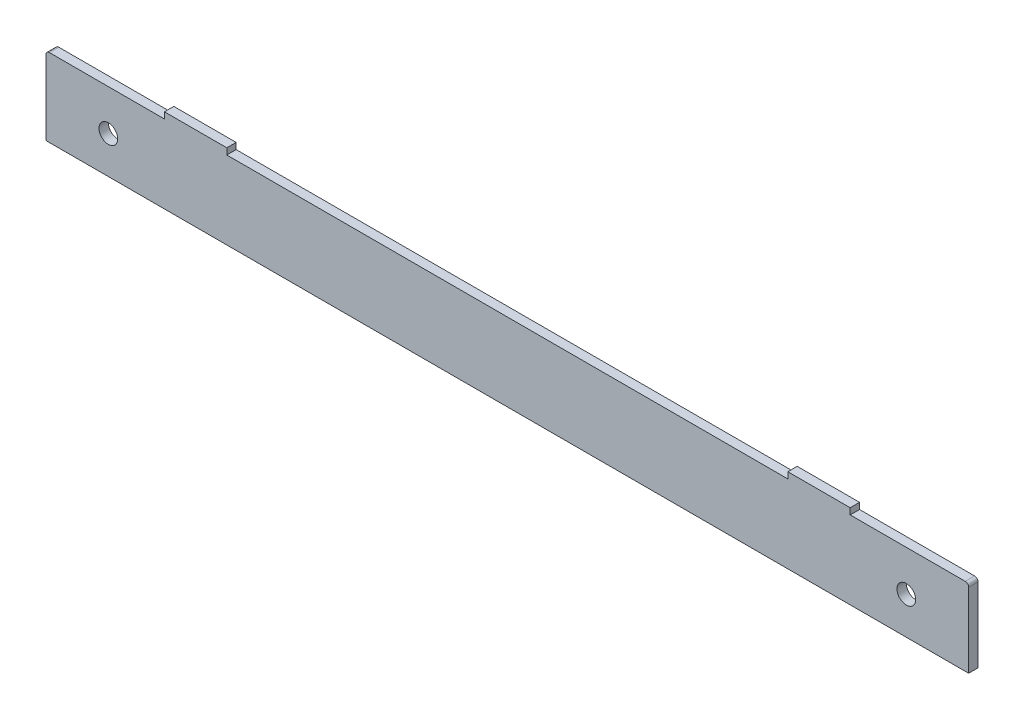
ISO-10303-21;
HEADER;
FILE_DESCRIPTION(('STEP AP214'),'2;1');
FILE_NAME('part.step','',(''),(''),'','','');
FILE_SCHEMA(('AUTOMOTIVE_DESIGN { 1 0 10303 214 1 1 1 1 }'));
ENDSEC;
DATA;
#1=APPLICATION_CONTEXT('core data for automotive mechanical design processes');
#2=APPLICATION_PROTOCOL_DEFINITION('international standard','automotive_design',2000,#1);
#3=PRODUCT_CONTEXT('',#1,'mechanical');
#4=PRODUCT('Part','Part','',(#3));
#5=PRODUCT_RELATED_PRODUCT_CATEGORY('part','',(#4));
#6=PRODUCT_DEFINITION_FORMATION('','',#4);
#7=PRODUCT_DEFINITION_CONTEXT('part definition',#1,'design');
#8=PRODUCT_DEFINITION('design','',#6,#7);
#9=PRODUCT_DEFINITION_SHAPE('','',#8);
#10=(LENGTH_UNIT() NAMED_UNIT(*) SI_UNIT(.MILLI.,.METRE.));
#11=(NAMED_UNIT(*) PLANE_ANGLE_UNIT() SI_UNIT($,.RADIAN.));
#12=(NAMED_UNIT(*) SI_UNIT($,.STERADIAN.) SOLID_ANGLE_UNIT());
#13=UNCERTAINTY_MEASURE_WITH_UNIT(LENGTH_MEASURE(1.E-05),#10,'distance_accuracy_value','');
#14=(GEOMETRIC_REPRESENTATION_CONTEXT(3) GLOBAL_UNCERTAINTY_ASSIGNED_CONTEXT((#13)) GLOBAL_UNIT_ASSIGNED_CONTEXT((#10,
#11,#12)) REPRESENTATION_CONTEXT('',''));
#15=CARTESIAN_POINT('',(0.,0.,0.));
#16=DIRECTION('',(0.,0.,1.));
#17=DIRECTION('',(1.,0.,0.));
#18=AXIS2_PLACEMENT_3D('',#15,#16,#17);
#19=CARTESIAN_POINT('',(-52.7153432272541,26.1805647840531,-3.));
#20=DIRECTION('',(0.,1.,0.));
#21=DIRECTION('',(0.,0.,1.));
#22=AXIS2_PLACEMENT_3D('',#19,#20,#21);
#23=PLANE('',#22);
#24=DIRECTION('',(-1.,0.,0.));
#25=VECTOR('',#24,1.);
#26=CARTESIAN_POINT('',(-52.7153432272541,26.1805647840531,0.));
#27=LINE('',#26,#25);
#28=CARTESIAN_POINT('',(184.184656772746,26.1805647840531,0.));
#29=VERTEX_POINT('',#28);
#30=CARTESIAN_POINT('',(4.18465677274588,26.1805647840531,0.));
#31=VERTEX_POINT('',#30);
#32=EDGE_CURVE('E218',#29,#31,#27,.T.);
#33=ORIENTED_EDGE('',*,*,#32,.F.);
#34=DIRECTION('',(0.,0.,1.));
#35=VECTOR('',#34,1.);
#36=CARTESIAN_POINT('',(184.184656772746,26.1805647840531,-3.00000000000005));
#37=LINE('',#36,#35);
#38=CARTESIAN_POINT('',(184.184656772746,26.1805647840531,-3.00000000000005));
#39=VERTEX_POINT('',#38);
#40=EDGE_CURVE('E52',#39,#29,#37,.T.);
#41=ORIENTED_EDGE('',*,*,#40,.F.);
#42=DIRECTION('',(-1.,0.,0.));
#43=VECTOR('',#42,1.);
#44=CARTESIAN_POINT('',(-52.7153432272541,26.1805647840531,-3.));
#45=LINE('',#44,#43);
#46=CARTESIAN_POINT('',(4.18465677274588,26.1805647840531,-3.));
#47=VERTEX_POINT('',#46);
#48=EDGE_CURVE('E200',#39,#47,#45,.T.);
#49=ORIENTED_EDGE('',*,*,#48,.T.);
#50=DIRECTION('',(0.,0.,-1.));
#51=VECTOR('',#50,1.);
#52=CARTESIAN_POINT('',(4.18465677274588,26.1805647840531,-3.));
#53=LINE('',#52,#51);
#54=EDGE_CURVE('E160',#31,#47,#53,.T.);
#55=ORIENTED_EDGE('',*,*,#54,.F.);
#56=EDGE_LOOP('',(#33,#41,#49,#55));
#57=FACE_BOUND('',#56,.T.);
#58=ADVANCED_FACE('F35',(#57),#23,.T.);
#59=CARTESIAN_POINT('',(241.084656772746,26.1805647840531,-3.));
#60=VERTEX_POINT('',#59);
#61=CARTESIAN_POINT('',(204.184656772746,26.1805647840531,-3.00000000000004));
#62=VERTEX_POINT('',#61);
#63=EDGE_CURVE('E196',#60,#62,#45,.T.);
#64=ORIENTED_EDGE('',*,*,#63,.T.);
#65=DIRECTION('',(0.,0.,-1.));
#66=VECTOR('',#65,1.);
#67=CARTESIAN_POINT('',(204.184656772746,26.1805647840531,-3.00000000000004));
#68=LINE('',#67,#66);
#69=CARTESIAN_POINT('',(204.184656772746,26.1805647840531,0.));
#70=VERTEX_POINT('',#69);
#71=EDGE_CURVE('E156',#70,#62,#68,.T.);
#72=ORIENTED_EDGE('',*,*,#71,.F.);
#73=CARTESIAN_POINT('',(241.084656772746,26.1805647840531,0.));
#74=VERTEX_POINT('',#73);
#75=EDGE_CURVE('E215',#74,#70,#27,.T.);
#76=ORIENTED_EDGE('',*,*,#75,.F.);
#77=DIRECTION('',(0.,0.,1.));
#78=VECTOR('',#77,1.);
#79=CARTESIAN_POINT('',(241.084656772746,26.1805647840531,-3.));
#80=LINE('',#79,#78);
#81=EDGE_CURVE('E232',#60,#74,#80,.T.);
#82=ORIENTED_EDGE('',*,*,#81,.F.);
#83=EDGE_LOOP('',(#64,#72,#76,#82));
#84=FACE_BOUND('',#83,.T.);
#85=ADVANCED_FACE('F262',(#84),#23,.T.);
#86=CARTESIAN_POINT('',(-15.8153432272541,26.1805647840531,0.));
#87=VERTEX_POINT('',#86);
#88=CARTESIAN_POINT('',(-52.7153432272541,26.1805647840531,0.));
#89=VERTEX_POINT('',#88);
#90=EDGE_CURVE('E214',#87,#89,#27,.T.);
#91=ORIENTED_EDGE('',*,*,#90,.F.);
#92=DIRECTION('',(0.,0.,1.));
#93=VECTOR('',#92,1.);
#94=CARTESIAN_POINT('',(-15.8153432272541,26.1805647840531,-3.));
#95=LINE('',#94,#93);
#96=CARTESIAN_POINT('',(-15.8153432272541,26.1805647840531,-3.));
#97=VERTEX_POINT('',#96);
#98=EDGE_CURVE('E60',#97,#87,#95,.T.);
#99=ORIENTED_EDGE('',*,*,#98,.F.);
#100=CARTESIAN_POINT('',(-52.7153432272541,26.1805647840531,-3.));
#101=VERTEX_POINT('',#100);
#102=EDGE_CURVE('E195',#97,#101,#45,.T.);
#103=ORIENTED_EDGE('',*,*,#102,.T.);
#104=DIRECTION('',(0.,0.,1.));
#105=VECTOR('',#104,1.);
#106=CARTESIAN_POINT('',(-52.7153432272541,26.1805647840531,-3.));
#107=LINE('',#106,#105);
#108=EDGE_CURVE('E229',#101,#89,#107,.T.);
#109=ORIENTED_EDGE('',*,*,#108,.T.);
#110=EDGE_LOOP('',(#91,#99,#103,#109));
#111=FACE_BOUND('',#110,.T.);
#112=ADVANCED_FACE('F284',(#111),#23,.T.);
#113=CARTESIAN_POINT('',(242.184656772746,25.0805647840531,-3.));
#114=DIRECTION('',(1.,0.,0.));
#115=DIRECTION('',(0.,0.,-1.));
#116=AXIS2_PLACEMENT_3D('',#113,#114,#115);
#117=PLANE('',#116);
#118=DIRECTION('',(0.,1.,0.));
#119=VECTOR('',#118,1.);
#120=CARTESIAN_POINT('',(242.184656772746,25.0805647840531,0.));
#121=LINE('',#120,#119);
#122=CARTESIAN_POINT('',(242.184656772746,1.18056478405314,0.));
#123=VERTEX_POINT('',#122);
#124=CARTESIAN_POINT('',(242.184656772746,25.0805647840531,0.));
#125=VERTEX_POINT('',#124);
#126=EDGE_CURVE('E187',#123,#125,#121,.T.);
#127=ORIENTED_EDGE('',*,*,#126,.F.);
#128=DIRECTION('',(0.,0.,1.));
#129=VECTOR('',#128,1.);
#130=CARTESIAN_POINT('',(242.184656772746,1.18056478405314,-3.));
#131=LINE('',#130,#129);
#132=CARTESIAN_POINT('',(242.184656772746,1.18056478405314,-3.));
#133=VERTEX_POINT('',#132);
#134=EDGE_CURVE('E11',#133,#123,#131,.T.);
#135=ORIENTED_EDGE('',*,*,#134,.F.);
#136=DIRECTION('',(0.,1.,0.));
#137=VECTOR('',#136,1.);
#138=CARTESIAN_POINT('',(242.184656772746,25.0805647840531,-3.));
#139=LINE('',#138,#137);
#140=CARTESIAN_POINT('',(242.184656772746,25.0805647840531,-3.));
#141=VERTEX_POINT('',#140);
#142=EDGE_CURVE('E188',#133,#141,#139,.T.);
#143=ORIENTED_EDGE('',*,*,#142,.T.);
#144=DIRECTION('',(0.,0.,1.));
#145=VECTOR('',#144,1.);
#146=CARTESIAN_POINT('',(242.184656772746,25.0805647840531,-3.));
#147=LINE('',#146,#145);
#148=EDGE_CURVE('E209',#141,#125,#147,.T.);
#149=ORIENTED_EDGE('',*,*,#148,.T.);
#150=EDGE_LOOP('',(#127,#135,#143,#149));
#151=FACE_BOUND('',#150,.T.);
#152=ADVANCED_FACE('F37',(#151),#117,.T.);
#153=CARTESIAN_POINT('',(-53.8153432272541,1.18056478405314,-3.));
#154=DIRECTION('',(0.,-1.,0.));
#155=DIRECTION('',(0.,0.,-1.));
#156=AXIS2_PLACEMENT_3D('',#153,#154,#155);
#157=PLANE('',#156);
#158=DIRECTION('',(1.,0.,0.));
#159=VECTOR('',#158,1.);
#160=CARTESIAN_POINT('',(-53.8153432272541,1.18056478405314,0.));
#161=LINE('',#160,#159);
#162=CARTESIAN_POINT('',(-53.8153432272541,1.18056478405314,0.));
#163=VERTEX_POINT('',#162);
#164=EDGE_CURVE('E192',#163,#123,#161,.T.);
#165=ORIENTED_EDGE('',*,*,#164,.F.);
#166=DIRECTION('',(0.,0.,1.));
#167=VECTOR('',#166,1.);
#168=CARTESIAN_POINT('',(-53.8153432272541,1.18056478405314,-3.));
#169=LINE('',#168,#167);
#170=CARTESIAN_POINT('',(-53.8153432272541,1.18056478405314,-3.));
#171=VERTEX_POINT('',#170);
#172=EDGE_CURVE('E44',#171,#163,#169,.T.);
#173=ORIENTED_EDGE('',*,*,#172,.F.);
#174=DIRECTION('',(1.,0.,0.));
#175=VECTOR('',#174,1.);
#176=CARTESIAN_POINT('',(-53.8153432272541,1.18056478405314,-3.));
#177=LINE('',#176,#175);
#178=EDGE_CURVE('E206',#171,#133,#177,.T.);
#179=ORIENTED_EDGE('',*,*,#178,.T.);
#180=ORIENTED_EDGE('',*,*,#134,.T.);
#181=EDGE_LOOP('',(#165,#173,#179,#180));
#182=FACE_BOUND('',#181,.T.);
#183=ADVANCED_FACE('F272',(#182),#157,.T.);
#184=CARTESIAN_POINT('',(-53.8153432272541,25.0805647840531,-3.));
#185=DIRECTION('',(-1.,0.,0.));
#186=DIRECTION('',(0.,0.,1.));
#187=AXIS2_PLACEMENT_3D('',#184,#185,#186);
#188=PLANE('',#187);
#189=DIRECTION('',(0.,-1.,0.));
#190=VECTOR('',#189,1.);
#191=CARTESIAN_POINT('',(-53.8153432272541,25.0805647840531,0.));
#192=LINE('',#191,#190);
#193=CARTESIAN_POINT('',(-53.8153432272541,25.0805647840531,0.));
#194=VERTEX_POINT('',#193);
#195=EDGE_CURVE('E221',#194,#163,#192,.T.);
#196=ORIENTED_EDGE('',*,*,#195,.F.);
#197=DIRECTION('',(0.,0.,1.));
#198=VECTOR('',#197,1.);
#199=CARTESIAN_POINT('',(-53.8153432272541,25.0805647840531,-3.));
#200=LINE('',#199,#198);
#201=CARTESIAN_POINT('',(-53.8153432272541,25.0805647840531,-3.));
#202=VERTEX_POINT('',#201);
#203=EDGE_CURVE('E227',#202,#194,#200,.T.);
#204=ORIENTED_EDGE('',*,*,#203,.F.);
#205=DIRECTION('',(0.,-1.,0.));
#206=VECTOR('',#205,1.);
#207=CARTESIAN_POINT('',(-53.8153432272541,25.0805647840531,-3.));
#208=LINE('',#207,#206);
#209=EDGE_CURVE('E203',#202,#171,#208,.T.);
#210=ORIENTED_EDGE('',*,*,#209,.T.);
#211=ORIENTED_EDGE('',*,*,#172,.T.);
#212=EDGE_LOOP('',(#196,#204,#210,#211));
#213=FACE_BOUND('',#212,.T.);
#214=ADVANCED_FACE('F323',(#213),#188,.T.);
#215=CARTESIAN_POINT('',(-52.7153432272541,25.0805647840531,-3.));
#216=DIRECTION('',(0.,0.,1.));
#217=DIRECTION('',(1.,0.,0.));
#218=AXIS2_PLACEMENT_3D('',#215,#216,#217);
#219=CYLINDRICAL_SURFACE('',#218,1.1);
#220=CARTESIAN_POINT('',(-52.7153432272541,25.0805647840531,0.));
#221=DIRECTION('',(0.,0.,1.));
#222=DIRECTION('',(-1.,0.,0.));
#223=AXIS2_PLACEMENT_3D('',#220,#221,#222);
#224=CIRCLE('',#223,1.1);
#225=EDGE_CURVE('E217',#89,#194,#224,.T.);
#226=ORIENTED_EDGE('',*,*,#225,.F.);
#227=ORIENTED_EDGE('',*,*,#108,.F.);
#228=CARTESIAN_POINT('',(-52.7153432272541,25.0805647840531,-3.));
#229=DIRECTION('',(0.,0.,1.));
#230=DIRECTION('',(-1.,0.,0.));
#231=AXIS2_PLACEMENT_3D('',#228,#229,#230);
#232=CIRCLE('',#231,1.1);
#233=EDGE_CURVE('E199',#101,#202,#232,.T.);
#234=ORIENTED_EDGE('',*,*,#233,.T.);
#235=ORIENTED_EDGE('',*,*,#203,.T.);
#236=EDGE_LOOP('',(#226,#227,#234,#235));
#237=FACE_BOUND('',#236,.T.);
#238=ADVANCED_FACE('F280',(#237),#219,.T.);
#239=CARTESIAN_POINT('',(241.084656772746,25.0805647840531,-3.));
#240=DIRECTION('',(0.,0.,1.));
#241=DIRECTION('',(1.,0.,0.));
#242=AXIS2_PLACEMENT_3D('',#239,#240,#241);
#243=CYLINDRICAL_SURFACE('',#242,1.09999999999999);
#244=CARTESIAN_POINT('',(241.084656772746,25.0805647840531,0.));
#245=DIRECTION('',(0.,0.,1.));
#246=DIRECTION('',(1.,0.,0.));
#247=AXIS2_PLACEMENT_3D('',#244,#245,#246);
#248=CIRCLE('',#247,1.09999999999999);
#249=EDGE_CURVE('E211',#125,#74,#248,.T.);
#250=ORIENTED_EDGE('',*,*,#249,.F.);
#251=ORIENTED_EDGE('',*,*,#148,.F.);
#252=CARTESIAN_POINT('',(241.084656772746,25.0805647840531,-3.));
#253=DIRECTION('',(0.,0.,1.));
#254=DIRECTION('',(1.,0.,0.));
#255=AXIS2_PLACEMENT_3D('',#252,#253,#254);
#256=CIRCLE('',#255,1.09999999999999);
#257=EDGE_CURVE('E191',#141,#60,#256,.T.);
#258=ORIENTED_EDGE('',*,*,#257,.T.);
#259=ORIENTED_EDGE('',*,*,#81,.T.);
#260=EDGE_LOOP('',(#250,#251,#258,#259));
#261=FACE_BOUND('',#260,.T.);
#262=ADVANCED_FACE('F266',(#261),#243,.T.);
#263=CARTESIAN_POINT('',(-52.7153432272541,25.0805647840531,-3.));
#264=DIRECTION('',(0.,0.,-1.));
#265=DIRECTION('',(-1.,0.,0.));
#266=AXIS2_PLACEMENT_3D('',#263,#264,#265);
#267=PLANE('',#266);
#268=CARTESIAN_POINT('',(-33.8153432272541,13.1305647840531,-3.));
#269=DIRECTION('',(0.,0.,-1.));
#270=DIRECTION('',(-1.,0.,0.));
#271=AXIS2_PLACEMENT_3D('',#268,#269,#270);
#272=CIRCLE('',#271,3.);
#273=CARTESIAN_POINT('',(-36.8153432272541,13.1305647840531,-3.));
#274=VERTEX_POINT('',#273);
#275=EDGE_CURVE('E245',#274,#274,#272,.T.);
#276=ORIENTED_EDGE('',*,*,#275,.F.);
#277=EDGE_LOOP('',(#276));
#278=FACE_BOUND('',#277,.T.);
#279=CARTESIAN_POINT('',(222.184656772746,13.1305647840531,-3.));
#280=DIRECTION('',(0.,0.,-1.));
#281=DIRECTION('',(-1.,0.,0.));
#282=AXIS2_PLACEMENT_3D('',#279,#280,#281);
#283=CIRCLE('',#282,2.99999999999999);
#284=CARTESIAN_POINT('',(219.184656772746,13.1305647840531,-3.));
#285=VERTEX_POINT('',#284);
#286=EDGE_CURVE('E236',#285,#285,#283,.T.);
#287=ORIENTED_EDGE('',*,*,#286,.F.);
#288=EDGE_LOOP('',(#287));
#289=FACE_BOUND('',#288,.T.);
#290=ORIENTED_EDGE('',*,*,#142,.F.);
#291=ORIENTED_EDGE('',*,*,#178,.F.);
#292=ORIENTED_EDGE('',*,*,#209,.F.);
#293=ORIENTED_EDGE('',*,*,#233,.F.);
#294=ORIENTED_EDGE('',*,*,#102,.F.);
#295=DIRECTION('',(0.,-1.,0.));
#296=VECTOR('',#295,1.);
#297=CARTESIAN_POINT('',(-15.8153432272541,28.1805647840531,-3.));
#298=LINE('',#297,#296);
#299=CARTESIAN_POINT('',(-15.8153432272541,28.1805647840531,-3.));
#300=VERTEX_POINT('',#299);
#301=EDGE_CURVE('E174',#300,#97,#298,.T.);
#302=ORIENTED_EDGE('',*,*,#301,.F.);
#303=DIRECTION('',(-1.,0.,0.));
#304=VECTOR('',#303,1.);
#305=CARTESIAN_POINT('',(-15.8153432272541,28.1805647840531,-3.));
#306=LINE('',#305,#304);
#307=CARTESIAN_POINT('',(4.18465677274588,28.1805647840531,-3.));
#308=VERTEX_POINT('',#307);
#309=EDGE_CURVE('E173',#308,#300,#306,.T.);
#310=ORIENTED_EDGE('',*,*,#309,.F.);
#311=DIRECTION('',(0.,-1.,0.));
#312=VECTOR('',#311,1.);
#313=CARTESIAN_POINT('',(4.18465677274588,28.1805647840531,-3.));
#314=LINE('',#313,#312);
#315=EDGE_CURVE('E179',#308,#47,#314,.T.);
#316=ORIENTED_EDGE('',*,*,#315,.T.);
#317=ORIENTED_EDGE('',*,*,#48,.F.);
#318=DIRECTION('',(0.,-1.,0.));
#319=VECTOR('',#318,1.);
#320=CARTESIAN_POINT('',(184.184656772746,28.1805647840531,-3.00000000000005));
#321=LINE('',#320,#319);
#322=CARTESIAN_POINT('',(184.184656772746,28.1805647840531,-3.00000000000005));
#323=VERTEX_POINT('',#322);
#324=EDGE_CURVE('E249',#323,#39,#321,.T.);
#325=ORIENTED_EDGE('',*,*,#324,.F.);
#326=DIRECTION('',(-1.,0.,0.));
#327=VECTOR('',#326,1.);
#328=CARTESIAN_POINT('',(184.184656772746,28.1805647840531,-3.00000000000005));
#329=LINE('',#328,#327);
#330=CARTESIAN_POINT('',(204.184656772746,28.1805647840531,-3.00000000000004));
#331=VERTEX_POINT('',#330);
#332=EDGE_CURVE('E154',#331,#323,#329,.T.);
#333=ORIENTED_EDGE('',*,*,#332,.F.);
#334=DIRECTION('',(0.,-1.,0.));
#335=VECTOR('',#334,1.);
#336=CARTESIAN_POINT('',(204.184656772746,28.1805647840531,-3.00000000000004));
#337=LINE('',#336,#335);
#338=EDGE_CURVE('E162',#331,#62,#337,.T.);
#339=ORIENTED_EDGE('',*,*,#338,.T.);
#340=ORIENTED_EDGE('',*,*,#63,.F.);
#341=ORIENTED_EDGE('',*,*,#257,.F.);
#342=EDGE_LOOP('',(#290,#291,#292,#293,#294,#302,#310,#316,#317,#325,#333,#339,#340,#341));
#343=FACE_BOUND('',#342,.T.);
#344=ADVANCED_FACE('F257',(#278,#289,#343),#267,.T.);
#345=CARTESIAN_POINT('',(-52.7153432272541,25.0805647840531,0.));
#346=DIRECTION('',(0.,0.,-1.));
#347=DIRECTION('',(-1.,0.,0.));
#348=AXIS2_PLACEMENT_3D('',#345,#346,#347);
#349=PLANE('',#348);
#350=CARTESIAN_POINT('',(-33.8153432272541,13.1305647840531,0.));
#351=DIRECTION('',(0.,0.,-1.));
#352=DIRECTION('',(-1.,0.,0.));
#353=AXIS2_PLACEMENT_3D('',#350,#351,#352);
#354=CIRCLE('',#353,3.);
#355=CARTESIAN_POINT('',(-36.8153432272541,13.1305647840531,0.));
#356=VERTEX_POINT('',#355);
#357=EDGE_CURVE('E39',#356,#356,#354,.T.);
#358=ORIENTED_EDGE('',*,*,#357,.T.);
#359=EDGE_LOOP('',(#358));
#360=FACE_BOUND('',#359,.T.);
#361=CARTESIAN_POINT('',(222.184656772746,13.1305647840531,0.));
#362=DIRECTION('',(0.,0.,-1.));
#363=DIRECTION('',(-1.,0.,0.));
#364=AXIS2_PLACEMENT_3D('',#361,#362,#363);
#365=CIRCLE('',#364,2.99999999999999);
#366=CARTESIAN_POINT('',(219.184656772746,13.1305647840531,0.));
#367=VERTEX_POINT('',#366);
#368=EDGE_CURVE('E234',#367,#367,#365,.T.);
#369=ORIENTED_EDGE('',*,*,#368,.T.);
#370=EDGE_LOOP('',(#369));
#371=FACE_BOUND('',#370,.T.);
#372=ORIENTED_EDGE('',*,*,#126,.T.);
#373=ORIENTED_EDGE('',*,*,#249,.T.);
#374=ORIENTED_EDGE('',*,*,#75,.T.);
#375=DIRECTION('',(0.,-1.,0.));
#376=VECTOR('',#375,1.);
#377=CARTESIAN_POINT('',(204.184656772746,28.1805647840531,0.));
#378=LINE('',#377,#376);
#379=CARTESIAN_POINT('',(204.184656772746,28.1805647840531,0.));
#380=VERTEX_POINT('',#379);
#381=EDGE_CURVE('E145',#380,#70,#378,.T.);
#382=ORIENTED_EDGE('',*,*,#381,.F.);
#383=DIRECTION('',(1.,0.,0.));
#384=VECTOR('',#383,1.);
#385=CARTESIAN_POINT('',(184.184656772746,28.1805647840531,0.));
#386=LINE('',#385,#384);
#387=CARTESIAN_POINT('',(184.184656772746,28.1805647840531,0.));
#388=VERTEX_POINT('',#387);
#389=EDGE_CURVE('E138',#388,#380,#386,.T.);
#390=ORIENTED_EDGE('',*,*,#389,.F.);
#391=DIRECTION('',(0.,-1.,0.));
#392=VECTOR('',#391,1.);
#393=CARTESIAN_POINT('',(184.184656772746,28.1805647840531,0.));
#394=LINE('',#393,#392);
#395=EDGE_CURVE('E142',#388,#29,#394,.T.);
#396=ORIENTED_EDGE('',*,*,#395,.T.);
#397=ORIENTED_EDGE('',*,*,#32,.T.);
#398=DIRECTION('',(0.,-1.,0.));
#399=VECTOR('',#398,1.);
#400=CARTESIAN_POINT('',(4.18465677274588,28.1805647840531,0.));
#401=LINE('',#400,#399);
#402=CARTESIAN_POINT('',(4.18465677274588,28.1805647840531,0.));
#403=VERTEX_POINT('',#402);
#404=EDGE_CURVE('E182',#403,#31,#401,.T.);
#405=ORIENTED_EDGE('',*,*,#404,.F.);
#406=DIRECTION('',(1.,0.,0.));
#407=VECTOR('',#406,1.);
#408=CARTESIAN_POINT('',(-15.8153432272541,28.1805647840531,0.));
#409=LINE('',#408,#407);
#410=CARTESIAN_POINT('',(-15.8153432272541,28.1805647840531,0.));
#411=VERTEX_POINT('',#410);
#412=EDGE_CURVE('E169',#411,#403,#409,.T.);
#413=ORIENTED_EDGE('',*,*,#412,.F.);
#414=DIRECTION('',(0.,-1.,0.));
#415=VECTOR('',#414,1.);
#416=CARTESIAN_POINT('',(-15.8153432272541,28.1805647840531,0.));
#417=LINE('',#416,#415);
#418=EDGE_CURVE('E185',#411,#87,#417,.T.);
#419=ORIENTED_EDGE('',*,*,#418,.T.);
#420=ORIENTED_EDGE('',*,*,#90,.T.);
#421=ORIENTED_EDGE('',*,*,#225,.T.);
#422=ORIENTED_EDGE('',*,*,#195,.T.);
#423=ORIENTED_EDGE('',*,*,#164,.T.);
#424=EDGE_LOOP('',(#372,#373,#374,#382,#390,#396,#397,#405,#413,#419,#420,#421,#422,#423));
#425=FACE_BOUND('',#424,.T.);
#426=ADVANCED_FACE('F141',(#360,#371,#425),#349,.F.);
#427=CARTESIAN_POINT('',(-15.8153432272541,28.1805647840531,-3.));
#428=DIRECTION('',(1.,0.,0.));
#429=DIRECTION('',(0.,0.,-1.));
#430=AXIS2_PLACEMENT_3D('',#427,#428,#429);
#431=PLANE('',#430);
#432=ORIENTED_EDGE('',*,*,#98,.T.);
#433=ORIENTED_EDGE('',*,*,#418,.F.);
#434=DIRECTION('',(0.,0.,1.));
#435=VECTOR('',#434,1.);
#436=CARTESIAN_POINT('',(-15.8153432272541,28.1805647840531,-3.));
#437=LINE('',#436,#435);
#438=EDGE_CURVE('E166',#300,#411,#437,.T.);
#439=ORIENTED_EDGE('',*,*,#438,.F.);
#440=ORIENTED_EDGE('',*,*,#301,.T.);
#441=EDGE_LOOP('',(#432,#433,#439,#440));
#442=FACE_BOUND('',#441,.T.);
#443=ADVANCED_FACE('F298',(#442),#431,.F.);
#444=CARTESIAN_POINT('',(4.18465677274588,28.1805647840531,-3.));
#445=DIRECTION('',(-1.,0.,0.));
#446=DIRECTION('',(0.,0.,1.));
#447=AXIS2_PLACEMENT_3D('',#444,#445,#446);
#448=PLANE('',#447);
#449=ORIENTED_EDGE('',*,*,#54,.T.);
#450=ORIENTED_EDGE('',*,*,#315,.F.);
#451=DIRECTION('',(0.,0.,-1.));
#452=VECTOR('',#451,1.);
#453=CARTESIAN_POINT('',(4.18465677274588,28.1805647840531,-3.));
#454=LINE('',#453,#452);
#455=EDGE_CURVE('E171',#403,#308,#454,.T.);
#456=ORIENTED_EDGE('',*,*,#455,.F.);
#457=ORIENTED_EDGE('',*,*,#404,.T.);
#458=EDGE_LOOP('',(#449,#450,#456,#457));
#459=FACE_BOUND('',#458,.T.);
#460=ADVANCED_FACE('F291',(#459),#448,.F.);
#461=CARTESIAN_POINT('',(0.,28.1805647840531,0.));
#462=DIRECTION('',(0.,1.,0.));
#463=DIRECTION('',(0.,0.,1.));
#464=AXIS2_PLACEMENT_3D('',#461,#462,#463);
#465=PLANE('',#464);
#466=ORIENTED_EDGE('',*,*,#438,.T.);
#467=ORIENTED_EDGE('',*,*,#412,.T.);
#468=ORIENTED_EDGE('',*,*,#455,.T.);
#469=ORIENTED_EDGE('',*,*,#309,.T.);
#470=EDGE_LOOP('',(#466,#467,#468,#469));
#471=FACE_BOUND('',#470,.T.);
#472=ADVANCED_FACE('F297',(#471),#465,.T.);
#473=CARTESIAN_POINT('',(184.184656772746,28.1805647840531,-3.00000000000005));
#474=DIRECTION('',(1.,0.,0.));
#475=DIRECTION('',(0.,0.,-1.));
#476=AXIS2_PLACEMENT_3D('',#473,#474,#475);
#477=PLANE('',#476);
#478=ORIENTED_EDGE('',*,*,#40,.T.);
#479=ORIENTED_EDGE('',*,*,#395,.F.);
#480=DIRECTION('',(0.,0.,1.));
#481=VECTOR('',#480,1.);
#482=CARTESIAN_POINT('',(184.184656772746,28.1805647840531,-3.00000000000005));
#483=LINE('',#482,#481);
#484=EDGE_CURVE('E149',#323,#388,#483,.T.);
#485=ORIENTED_EDGE('',*,*,#484,.F.);
#486=ORIENTED_EDGE('',*,*,#324,.T.);
#487=EDGE_LOOP('',(#478,#479,#485,#486));
#488=FACE_BOUND('',#487,.T.);
#489=ADVANCED_FACE('F158',(#488),#477,.F.);
#490=CARTESIAN_POINT('',(204.184656772746,28.1805647840531,-3.00000000000004));
#491=DIRECTION('',(-1.,0.,0.));
#492=DIRECTION('',(0.,0.,1.));
#493=AXIS2_PLACEMENT_3D('',#490,#491,#492);
#494=PLANE('',#493);
#495=ORIENTED_EDGE('',*,*,#71,.T.);
#496=ORIENTED_EDGE('',*,*,#338,.F.);
#497=DIRECTION('',(0.,0.,-1.));
#498=VECTOR('',#497,1.);
#499=CARTESIAN_POINT('',(204.184656772746,28.1805647840531,-3.00000000000004));
#500=LINE('',#499,#498);
#501=EDGE_CURVE('E148',#380,#331,#500,.T.);
#502=ORIENTED_EDGE('',*,*,#501,.F.);
#503=ORIENTED_EDGE('',*,*,#381,.T.);
#504=EDGE_LOOP('',(#495,#496,#502,#503));
#505=FACE_BOUND('',#504,.T.);
#506=ADVANCED_FACE('F357',(#505),#494,.F.);
#507=CARTESIAN_POINT('',(0.,28.1805647840531,0.));
#508=DIRECTION('',(0.,1.,0.));
#509=DIRECTION('',(0.,0.,1.));
#510=AXIS2_PLACEMENT_3D('',#507,#508,#509);
#511=PLANE('',#510);
#512=ORIENTED_EDGE('',*,*,#484,.T.);
#513=ORIENTED_EDGE('',*,*,#389,.T.);
#514=ORIENTED_EDGE('',*,*,#501,.T.);
#515=ORIENTED_EDGE('',*,*,#332,.T.);
#516=EDGE_LOOP('',(#512,#513,#514,#515));
#517=FACE_BOUND('',#516,.T.);
#518=ADVANCED_FACE('F152',(#517),#511,.T.);
#519=CARTESIAN_POINT('',(222.184656772746,13.1305647840531,7.));
#520=DIRECTION('',(0.,0.,-1.));
#521=DIRECTION('',(-1.,0.,0.));
#522=AXIS2_PLACEMENT_3D('',#519,#520,#521);
#523=CYLINDRICAL_SURFACE('',#522,2.99999999999999);
#524=ORIENTED_EDGE('',*,*,#286,.T.);
#525=EDGE_LOOP('',(#524));
#526=FACE_BOUND('',#525,.T.);
#527=ORIENTED_EDGE('',*,*,#368,.F.);
#528=EDGE_LOOP('',(#527));
#529=FACE_BOUND('',#528,.T.);
#530=ADVANCED_FACE('F347',(#526,#529),#523,.F.);
#531=CARTESIAN_POINT('',(-33.8153432272541,13.1305647840531,7.));
#532=DIRECTION('',(0.,0.,-1.));
#533=DIRECTION('',(-1.,0.,0.));
#534=AXIS2_PLACEMENT_3D('',#531,#532,#533);
#535=CYLINDRICAL_SURFACE('',#534,3.);
#536=ORIENTED_EDGE('',*,*,#275,.T.);
#537=EDGE_LOOP('',(#536));
#538=FACE_BOUND('',#537,.T.);
#539=ORIENTED_EDGE('',*,*,#357,.F.);
#540=EDGE_LOOP('',(#539));
#541=FACE_BOUND('',#540,.T.);
#542=ADVANCED_FACE('F344',(#538,#541),#535,.F.);
#543=CLOSED_SHELL('',(#58,#85,#112,#152,#183,#214,#238,#262,#344,#426,#443,#460,#472,#489,#506,
#518,#530,#542));
#544=MANIFOLD_SOLID_BREP('B2',#543);
#545=ADVANCED_BREP_SHAPE_REPRESENTATION('',(#18,#544),#14);
#546=SHAPE_DEFINITION_REPRESENTATION(#9,#545);
ENDSEC;
END-ISO-10303-21;
